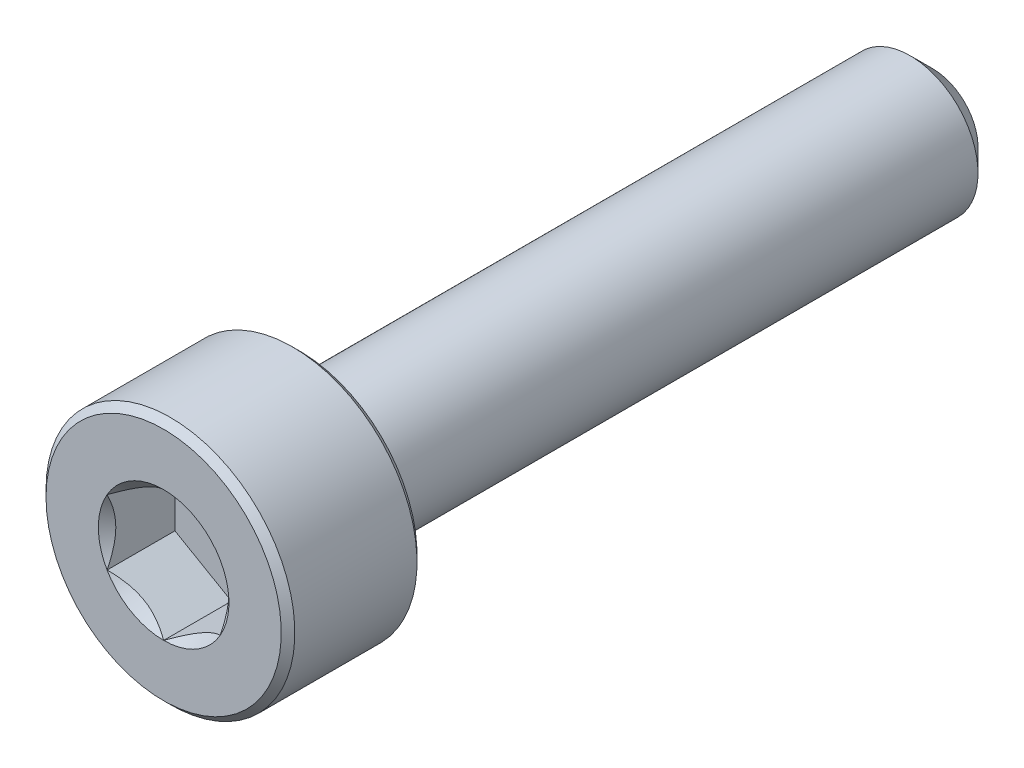
ISO-10303-21;
HEADER;
FILE_DESCRIPTION(('STEP AP214'),'2;1');
FILE_NAME('part.step','',(''),(''),'','','');
FILE_SCHEMA(('AUTOMOTIVE_DESIGN { 1 0 10303 214 1 1 1 1 }'));
ENDSEC;
DATA;
#1=APPLICATION_CONTEXT('core data for automotive mechanical design processes');
#2=APPLICATION_PROTOCOL_DEFINITION('international standard','automotive_design',2000,#1);
#3=PRODUCT_CONTEXT('',#1,'mechanical');
#4=PRODUCT('Part','Part','',(#3));
#5=PRODUCT_RELATED_PRODUCT_CATEGORY('part','',(#4));
#6=PRODUCT_DEFINITION_FORMATION('','',#4);
#7=PRODUCT_DEFINITION_CONTEXT('part definition',#1,'design');
#8=PRODUCT_DEFINITION('design','',#6,#7);
#9=PRODUCT_DEFINITION_SHAPE('','',#8);
#10=(LENGTH_UNIT() NAMED_UNIT(*) SI_UNIT(.MILLI.,.METRE.));
#11=(NAMED_UNIT(*) PLANE_ANGLE_UNIT() SI_UNIT($,.RADIAN.));
#12=(NAMED_UNIT(*) SI_UNIT($,.STERADIAN.) SOLID_ANGLE_UNIT());
#13=UNCERTAINTY_MEASURE_WITH_UNIT(LENGTH_MEASURE(1.E-05),#10,'distance_accuracy_value','');
#14=(GEOMETRIC_REPRESENTATION_CONTEXT(3) GLOBAL_UNCERTAINTY_ASSIGNED_CONTEXT((#13)) GLOBAL_UNIT_ASSIGNED_CONTEXT((#10,
#11,#12)) REPRESENTATION_CONTEXT('',''));
#15=CARTESIAN_POINT('',(0.,0.,0.));
#16=DIRECTION('',(0.,0.,1.));
#17=DIRECTION('',(1.,0.,0.));
#18=AXIS2_PLACEMENT_3D('',#15,#16,#17);
#19=CARTESIAN_POINT('',(0.,2.6,8.5));
#20=DIRECTION('',(0.,0.,1.));
#21=DIRECTION('',(1.,0.,0.));
#22=AXIS2_PLACEMENT_3D('',#19,#20,#21);
#23=PLANE('',#22);
#24=CARTESIAN_POINT('',(0.,0.,8.5));
#25=DIRECTION('',(0.,0.,1.));
#26=DIRECTION('',(1.,0.,0.));
#27=AXIS2_PLACEMENT_3D('',#24,#25,#26);
#28=CIRCLE('',#27,1.44337567297406);
#29=CARTESIAN_POINT('',(1.25,0.721687836487032,8.5));
#30=VERTEX_POINT('',#29);
#31=CARTESIAN_POINT('',(0.,1.44337567297406,8.5));
#32=VERTEX_POINT('',#31);
#33=EDGE_CURVE('E92',#30,#32,#28,.T.);
#34=ORIENTED_EDGE('',*,*,#33,.F.);
#35=CARTESIAN_POINT('',(1.25,-0.721687836487033,8.5));
#36=VERTEX_POINT('',#35);
#37=EDGE_CURVE('E52',#36,#30,#28,.T.);
#38=ORIENTED_EDGE('',*,*,#37,.F.);
#39=CARTESIAN_POINT('',(0.,-1.44337567297406,8.5));
#40=VERTEX_POINT('',#39);
#41=EDGE_CURVE('E278',#40,#36,#28,.T.);
#42=ORIENTED_EDGE('',*,*,#41,.F.);
#43=CARTESIAN_POINT('',(-1.25,-0.72168783648703,8.5));
#44=VERTEX_POINT('',#43);
#45=EDGE_CURVE('E59',#44,#40,#28,.T.);
#46=ORIENTED_EDGE('',*,*,#45,.F.);
#47=CARTESIAN_POINT('',(-1.25,0.721687836487034,8.5));
#48=VERTEX_POINT('',#47);
#49=EDGE_CURVE('E128',#48,#44,#28,.T.);
#50=ORIENTED_EDGE('',*,*,#49,.F.);
#51=EDGE_CURVE('E101',#32,#48,#28,.T.);
#52=ORIENTED_EDGE('',*,*,#51,.F.);
#53=EDGE_LOOP('',(#34,#38,#42,#46,#50,#52));
#54=FACE_BOUND('',#53,.T.);
#55=CARTESIAN_POINT('',(0.,0.,8.5));
#56=DIRECTION('',(0.,0.,-1.));
#57=DIRECTION('',(-1.,0.,0.));
#58=AXIS2_PLACEMENT_3D('',#55,#56,#57);
#59=CIRCLE('',#58,2.6);
#60=CARTESIAN_POINT('',(-2.6,0.,8.5));
#61=VERTEX_POINT('',#60);
#62=EDGE_CURVE('E46',#61,#61,#59,.T.);
#63=ORIENTED_EDGE('',*,*,#62,.F.);
#64=EDGE_LOOP('',(#63));
#65=FACE_BOUND('',#64,.T.);
#66=ADVANCED_FACE('F33',(#54,#65),#23,.T.);
#67=CARTESIAN_POINT('',(0.,0.,8.35));
#68=DIRECTION('',(0.,0.,-1.));
#69=DIRECTION('',(-1.,0.,0.));
#70=AXIS2_PLACEMENT_3D('',#67,#68,#69);
#71=CONICAL_SURFACE('',#70,2.75,0.785398163397443);
#72=ORIENTED_EDGE('',*,*,#62,.T.);
#73=EDGE_LOOP('',(#72));
#74=FACE_BOUND('',#73,.T.);
#75=CARTESIAN_POINT('',(0.,0.,8.35));
#76=DIRECTION('',(0.,0.,-1.));
#77=DIRECTION('',(-1.,0.,0.));
#78=AXIS2_PLACEMENT_3D('',#75,#76,#77);
#79=CIRCLE('',#78,2.75);
#80=CARTESIAN_POINT('',(-2.75,0.,8.35));
#81=VERTEX_POINT('',#80);
#82=EDGE_CURVE('E212',#81,#81,#79,.T.);
#83=ORIENTED_EDGE('',*,*,#82,.F.);
#84=EDGE_LOOP('',(#83));
#85=FACE_BOUND('',#84,.T.);
#86=ADVANCED_FACE('F217',(#74,#85),#71,.T.);
#87=CARTESIAN_POINT('',(0.,0.,-8.5));
#88=DIRECTION('',(0.,0.,-1.));
#89=DIRECTION('',(-1.,0.,0.));
#90=AXIS2_PLACEMENT_3D('',#87,#88,#89);
#91=CYLINDRICAL_SURFACE('',#90,2.75);
#92=ORIENTED_EDGE('',*,*,#82,.T.);
#93=EDGE_LOOP('',(#92));
#94=FACE_BOUND('',#93,.T.);
#95=CARTESIAN_POINT('',(0.,0.,5.65));
#96=DIRECTION('',(0.,0.,-1.));
#97=DIRECTION('',(-1.,0.,0.));
#98=AXIS2_PLACEMENT_3D('',#95,#96,#97);
#99=CIRCLE('',#98,2.75);
#100=CARTESIAN_POINT('',(-2.75,0.,5.65));
#101=VERTEX_POINT('',#100);
#102=EDGE_CURVE('E209',#101,#101,#99,.T.);
#103=ORIENTED_EDGE('',*,*,#102,.F.);
#104=EDGE_LOOP('',(#103));
#105=FACE_BOUND('',#104,.T.);
#106=ADVANCED_FACE('F223',(#94,#105),#91,.T.);
#107=CARTESIAN_POINT('',(0.,0.,5.5));
#108=DIRECTION('',(0.,0.,1.));
#109=DIRECTION('',(1.,0.,0.));
#110=AXIS2_PLACEMENT_3D('',#107,#108,#109);
#111=CONICAL_SURFACE('',#110,2.6,0.785398163397448);
#112=ORIENTED_EDGE('',*,*,#102,.T.);
#113=EDGE_LOOP('',(#112));
#114=FACE_BOUND('',#113,.T.);
#115=CARTESIAN_POINT('',(0.,0.,5.5));
#116=DIRECTION('',(0.,0.,-1.));
#117=DIRECTION('',(-1.,0.,0.));
#118=AXIS2_PLACEMENT_3D('',#115,#116,#117);
#119=CIRCLE('',#118,2.6);
#120=CARTESIAN_POINT('',(-2.6,0.,5.5));
#121=VERTEX_POINT('',#120);
#122=EDGE_CURVE('E206',#121,#121,#119,.T.);
#123=ORIENTED_EDGE('',*,*,#122,.F.);
#124=EDGE_LOOP('',(#123));
#125=FACE_BOUND('',#124,.T.);
#126=ADVANCED_FACE('F227',(#114,#125),#111,.T.);
#127=CARTESIAN_POINT('',(0.,2.6,5.5));
#128=DIRECTION('',(0.,0.,-1.));
#129=DIRECTION('',(-1.,0.,0.));
#130=AXIS2_PLACEMENT_3D('',#127,#128,#129);
#131=PLANE('',#130);
#132=ORIENTED_EDGE('',*,*,#122,.T.);
#133=EDGE_LOOP('',(#132));
#134=FACE_BOUND('',#133,.T.);
#135=CARTESIAN_POINT('',(0.,0.,5.5));
#136=DIRECTION('',(0.,0.,-1.));
#137=DIRECTION('',(-1.,0.,0.));
#138=AXIS2_PLACEMENT_3D('',#135,#136,#137);
#139=CIRCLE('',#138,1.5);
#140=CARTESIAN_POINT('',(-1.5,0.,5.5));
#141=VERTEX_POINT('',#140);
#142=EDGE_CURVE('E203',#141,#141,#139,.T.);
#143=ORIENTED_EDGE('',*,*,#142,.F.);
#144=EDGE_LOOP('',(#143));
#145=FACE_BOUND('',#144,.T.);
#146=ADVANCED_FACE('F233',(#134,#145),#131,.T.);
#147=CARTESIAN_POINT('',(0.,0.,-8.5));
#148=DIRECTION('',(0.,0.,-1.));
#149=DIRECTION('',(-1.,0.,0.));
#150=AXIS2_PLACEMENT_3D('',#147,#148,#149);
#151=CYLINDRICAL_SURFACE('',#150,1.5);
#152=ORIENTED_EDGE('',*,*,#142,.T.);
#153=EDGE_LOOP('',(#152));
#154=FACE_BOUND('',#153,.T.);
#155=CARTESIAN_POINT('',(0.,0.,-7.99999999999999));
#156=DIRECTION('',(0.,0.,-1.));
#157=DIRECTION('',(-1.,0.,0.));
#158=AXIS2_PLACEMENT_3D('',#155,#156,#157);
#159=CIRCLE('',#158,1.5);
#160=CARTESIAN_POINT('',(-1.5,0.,-7.99999999999999));
#161=VERTEX_POINT('',#160);
#162=EDGE_CURVE('E200',#161,#161,#159,.T.);
#163=ORIENTED_EDGE('',*,*,#162,.F.);
#164=EDGE_LOOP('',(#163));
#165=FACE_BOUND('',#164,.T.);
#166=ADVANCED_FACE('F237',(#154,#165),#151,.T.);
#167=CARTESIAN_POINT('',(0.,0.,-8.5));
#168=DIRECTION('',(0.,0.,1.));
#169=DIRECTION('',(1.,0.,0.));
#170=AXIS2_PLACEMENT_3D('',#167,#168,#169);
#171=CONICAL_SURFACE('',#170,1.,0.785398163397443);
#172=ORIENTED_EDGE('',*,*,#162,.T.);
#173=EDGE_LOOP('',(#172));
#174=FACE_BOUND('',#173,.T.);
#175=CARTESIAN_POINT('',(0.,0.,-8.5));
#176=DIRECTION('',(0.,0.,-1.));
#177=DIRECTION('',(-1.,0.,0.));
#178=AXIS2_PLACEMENT_3D('',#175,#176,#177);
#179=CIRCLE('',#178,1.);
#180=CARTESIAN_POINT('',(-1.,0.,-8.5));
#181=VERTEX_POINT('',#180);
#182=EDGE_CURVE('E188',#181,#181,#179,.T.);
#183=ORIENTED_EDGE('',*,*,#182,.F.);
#184=EDGE_LOOP('',(#183));
#185=FACE_BOUND('',#184,.T.);
#186=ADVANCED_FACE('F240',(#174,#185),#171,.T.);
#187=CARTESIAN_POINT('',(0.,1.,-8.5));
#188=DIRECTION('',(0.,0.,-1.));
#189=DIRECTION('',(-1.,0.,0.));
#190=AXIS2_PLACEMENT_3D('',#187,#188,#189);
#191=PLANE('',#190);
#192=ORIENTED_EDGE('',*,*,#182,.T.);
#193=EDGE_LOOP('',(#192));
#194=FACE_BOUND('',#193,.T.);
#195=ADVANCED_FACE('F161',(#194),#191,.T.);
#196=CARTESIAN_POINT('',(0.,0.,8.5));
#197=DIRECTION('',(0.,0.,1.));
#198=DIRECTION('',(1.,0.,0.));
#199=AXIS2_PLACEMENT_3D('',#196,#197,#198);
#200=CONICAL_SURFACE('',#199,1.44337567297406,0.78539816339745);
#201=ORIENTED_EDGE('',*,*,#51,.T.);
#202=CARTESIAN_POINT('',(0.000199999999999744,1.4434911430279,8.50011548390914));
#203=CARTESIAN_POINT('',(-0.0427751670715867,1.41867941875065,8.47532166805511));
#204=CARTESIAN_POINT('',(-0.086469004745948,1.39345276980743,8.45198373441869));
#205=CARTESIAN_POINT('',(-0.175565930841942,1.34201263554194,8.40925200408454));
#206=CARTESIAN_POINT('',(-0.220977498357064,1.31579425481276,8.38988199236042));
#207=CARTESIAN_POINT('',(-0.312547820935259,1.26292610442246,8.35670048341348));
#208=CARTESIAN_POINT('',(-0.358683240175885,1.23628980770471,8.34280555905266));
#209=CARTESIAN_POINT('',(-0.451970080407592,1.18243062538508,8.32139728216064));
#210=CARTESIAN_POINT('',(-0.499118649136379,1.15520938653761,8.31386794156679));
#211=CARTESIAN_POINT('',(-0.580373556887251,1.10829684367467,8.3070744980507));
#212=CARTESIAN_POINT('',(-0.61437487662794,1.08866617256958,8.30606855910435));
#213=CARTESIAN_POINT('',(-0.682317764432477,1.04943932800611,8.30776141491132));
#214=CARTESIAN_POINT('',(-0.716259317655657,1.02984316311599,8.31046102721554));
#215=CARTESIAN_POINT('',(-0.783814856457499,0.9908399546035,8.31940893031638));
#216=CARTESIAN_POINT('',(-0.817428507286774,0.971433104248772,8.32566052589971));
#217=CARTESIAN_POINT('',(-0.884094638217812,0.932943395609906,8.34137568141391));
#218=CARTESIAN_POINT('',(-0.917146871030295,0.913860680098301,8.35084062008746));
#219=CARTESIAN_POINT('',(-1.00179969160026,0.864986351354569,8.37893139068759));
#220=CARTESIAN_POINT('',(-1.05286649242964,0.835502920149077,8.3996701574522));
#221=CARTESIAN_POINT('',(-1.15300085411325,0.777690319475909,8.44638713467148));
#222=CARTESIAN_POINT('',(-1.20207431157827,0.749357745598417,8.47234829594677));
#223=CARTESIAN_POINT('',(-1.2502,0.721572366433195,8.50011548390914));
#224=B_SPLINE_CURVE_WITH_KNOTS('',3,(#202,#203,#204,#205,#206,#207,#208,#209,#210,#211,#212,
#213,#214,#215,#216,#217,#218,#219,#220,#221,#222,#223),.UNSPECIFIED.,.F.,.F.,(4,2,2,2,2,2,2,2,
2,2,4),(0.,0.166533409618303,0.334037607289761,0.498880396489698,0.663307919240273,
0.780963963458825,0.898645970148452,1.01643764860773,1.13427993171549,1.32148652032141,
1.50809158792573),.UNSPECIFIED.);
#225=EDGE_CURVE('E11',#32,#48,#224,.T.);
#226=ORIENTED_EDGE('',*,*,#225,.F.);
#227=EDGE_LOOP('',(#201,#226));
#228=FACE_BOUND('',#227,.T.);
#229=ADVANCED_FACE('F105',(#228),#200,.F.);
#230=ORIENTED_EDGE('',*,*,#49,.T.);
#231=CARTESIAN_POINT('',(-1.25,-1.38510182026143,8.92237003651893));
#232=CARTESIAN_POINT('',(-1.25,-1.35111986791654,8.89714624624165));
#233=CARTESIAN_POINT('',(-1.25,-1.31694282798165,8.87218595709871));
#234=CARTESIAN_POINT('',(-1.25,-1.24812142703778,8.82289946459782));
#235=CARTESIAN_POINT('',(-1.25,-1.21347694519278,8.79857343015524));
#236=CARTESIAN_POINT('',(-1.25,-1.10822083307585,8.72636172374247));
#237=CARTESIAN_POINT('',(-1.25,-1.03680313809814,8.67963105654717));
#238=CARTESIAN_POINT('',(-1.25,-0.887382774503049,8.58837288422405));
#239=CARTESIAN_POINT('',(-1.25,-0.809230860354648,8.54408680062095));
#240=CARTESIAN_POINT('',(-1.25,-0.64909596962788,8.46341771993846));
#241=CARTESIAN_POINT('',(-1.25,-0.567127025778807,8.42700818374294));
#242=CARTESIAN_POINT('',(-1.25,-0.443557329507032,8.38248253765294));
#243=CARTESIAN_POINT('',(-1.25,-0.403672751512106,8.36961750891589));
#244=CARTESIAN_POINT('',(-1.25,-0.322988211982144,8.34709732599784));
#245=CARTESIAN_POINT('',(-1.25,-0.282188183066514,8.33744240892579));
#246=CARTESIAN_POINT('',(-1.25,-0.200572985420666,8.32199119638416));
#247=CARTESIAN_POINT('',(-1.25,-0.159769911896365,8.31613197737595));
#248=CARTESIAN_POINT('',(-1.25,-0.0777868304089238,8.30837795446847));
#249=CARTESIAN_POINT('',(-1.25,-0.0366068784025135,8.30648257133364));
#250=CARTESIAN_POINT('',(-1.25,0.0444682995491154,8.30677812945619));
#251=CARTESIAN_POINT('',(-1.25,0.0843640378229438,8.30884503442731));
#252=CARTESIAN_POINT('',(-1.25,0.163790547253528,8.31668957022574));
#253=CARTESIAN_POINT('',(-1.25,0.203321243504861,8.3224679461945));
#254=CARTESIAN_POINT('',(-1.25,0.282393986569086,8.33752741684666));
#255=CARTESIAN_POINT('',(-1.25,0.321924894821446,8.34686615693867));
#256=CARTESIAN_POINT('',(-1.25,0.400129025325507,8.36856655334425));
#257=CARTESIAN_POINT('',(-1.25,0.438802336675167,8.380927894012));
#258=CARTESIAN_POINT('',(-1.25,0.563172796674043,8.42526147457396));
#259=CARTESIAN_POINT('',(-1.25,0.647028633361639,8.46238856081833));
#260=CARTESIAN_POINT('',(-1.25,0.810774511829943,8.54485212067594));
#261=CARTESIAN_POINT('',(-1.25,0.890648632035887,8.59021863392704));
#262=CARTESIAN_POINT('',(-1.25,1.04325497137231,8.68372167893417));
#263=CARTESIAN_POINT('',(-1.25,1.11614441495489,8.73160472191527));
#264=CARTESIAN_POINT('',(-1.25,1.22353402780521,8.80558839420389));
#265=CARTESIAN_POINT('',(-1.25,1.25886567990417,8.83050307314204));
#266=CARTESIAN_POINT('',(-1.25,1.32904842299966,8.88098117650382));
#267=CARTESIAN_POINT('',(-1.25,1.36389964210964,8.90654442260415));
#268=CARTESIAN_POINT('',(-1.25,1.39855118205095,8.93237628525925));
#269=B_SPLINE_CURVE_WITH_KNOTS('',3,(#231,#232,#233,#234,#235,#236,#237,#238,#239,#240,#241,
#242,#243,#244,#245,#246,#247,#248,#249,#250,#251,#252,#253,#254,#255,#256,#257,#258,#259,#260,
#261,#262,#263,#264,#265,#266,#267,#268),.UNSPECIFIED.,.F.,.F.,(4,2,2,2,2,2,2,2,2,2,2,2,2,2,2,2,
2,2,4),(0.,0.126957685892467,0.253948844888987,0.509869208273041,0.77911544356967,
1.04743984536898,1.17305649245659,1.29868241592515,1.42216852630225,1.5456365903859,
1.6653025991614,1.78499264045314,1.90670905612004,2.02841276654157,2.30272027119573,
2.57804870101489,2.83955156876987,2.96924486861395,3.09890288771825),.UNSPECIFIED.);
#270=EDGE_CURVE('E100',#48,#44,#269,.F.);
#271=ORIENTED_EDGE('',*,*,#270,.F.);
#272=EDGE_LOOP('',(#230,#271));
#273=FACE_BOUND('',#272,.T.);
#274=ADVANCED_FACE('F255',(#273),#200,.F.);
#275=ORIENTED_EDGE('',*,*,#45,.T.);
#276=CARTESIAN_POINT('',(-1.2502,-0.721572366433195,8.50011548390914));
#277=CARTESIAN_POINT('',(-1.20722483292841,-0.746384090710444,8.47532166805511));
#278=CARTESIAN_POINT('',(-1.16353099525405,-0.771610739653664,8.45198373441869));
#279=CARTESIAN_POINT('',(-1.07443406915806,-0.823050873919154,8.40925200408454));
#280=CARTESIAN_POINT('',(-1.02902250164294,-0.849269254648333,8.38988199236042));
#281=CARTESIAN_POINT('',(-0.937452179064742,-0.902137405038635,8.35670048341348));
#282=CARTESIAN_POINT('',(-0.891316759824117,-0.928773701756386,8.34280555905266));
#283=CARTESIAN_POINT('',(-0.79802991959241,-0.982632884076012,8.32139728216064));
#284=CARTESIAN_POINT('',(-0.750881350863622,-1.00985412292348,8.31386794156679));
#285=CARTESIAN_POINT('',(-0.66962644311275,-1.05676666578643,8.3070744980507));
#286=CARTESIAN_POINT('',(-0.635625123372061,-1.07639733689152,8.30606855910435));
#287=CARTESIAN_POINT('',(-0.567682235567525,-1.11562418145499,8.30776141491132));
#288=CARTESIAN_POINT('',(-0.533740682344345,-1.1352203463451,8.31046102721554));
#289=CARTESIAN_POINT('',(-0.466185143542503,-1.1742235548576,8.31940893031638));
#290=CARTESIAN_POINT('',(-0.432571492713227,-1.19363040521232,8.32566052589971));
#291=CARTESIAN_POINT('',(-0.365905361782189,-1.23212011385119,8.3413756814139));
#292=CARTESIAN_POINT('',(-0.332853128969707,-1.2512028293628,8.35084062008746));
#293=CARTESIAN_POINT('',(-0.248200308399738,-1.30007715810653,8.37893139068759));
#294=CARTESIAN_POINT('',(-0.197133507570363,-1.32956058931202,8.3996701574522));
#295=CARTESIAN_POINT('',(-0.0969991458867461,-1.38737318998519,8.44638713467148));
#296=CARTESIAN_POINT('',(-0.0479256884217311,-1.41570576386268,8.47234829594677));
#297=CARTESIAN_POINT('',(0.000199999999999774,-1.4434911430279,8.50011548390914));
#298=B_SPLINE_CURVE_WITH_KNOTS('',3,(#276,#277,#278,#279,#280,#281,#282,#283,#284,#285,#286,
#287,#288,#289,#290,#291,#292,#293,#294,#295,#296,#297),.UNSPECIFIED.,.F.,.F.,(4,2,2,2,2,2,2,2,
2,2,4),(0.,0.166533409618303,0.33403760728976,0.498880396489696,0.663307919240272,
0.780963963458825,0.898645970148451,1.01643764860773,1.13427993171549,1.32148652032141,
1.50809158792574),.UNSPECIFIED.);
#299=EDGE_CURVE('E137',#44,#40,#298,.T.);
#300=ORIENTED_EDGE('',*,*,#299,.F.);
#301=EDGE_LOOP('',(#275,#300));
#302=FACE_BOUND('',#301,.T.);
#303=ADVANCED_FACE('F259',(#302),#200,.F.);
#304=ORIENTED_EDGE('',*,*,#41,.T.);
#305=CARTESIAN_POINT('',(-0.000200000000000316,-1.4434911430279,8.50011548390914));
#306=CARTESIAN_POINT('',(0.0427751670715862,-1.41867941875065,8.47532166805511));
#307=CARTESIAN_POINT('',(0.0864690047459475,-1.39345276980743,8.45198373441869));
#308=CARTESIAN_POINT('',(0.175565930841941,-1.34201263554194,8.40925200408454));
#309=CARTESIAN_POINT('',(0.220977498357063,-1.31579425481276,8.38988199236042));
#310=CARTESIAN_POINT('',(0.312547820935258,-1.26292610442246,8.35670048341348));
#311=CARTESIAN_POINT('',(0.358683240175884,-1.23628980770471,8.34280555905266));
#312=CARTESIAN_POINT('',(0.45197008040759,-1.18243062538509,8.32139728216064));
#313=CARTESIAN_POINT('',(0.499118649136378,-1.15520938653761,8.31386794156679));
#314=CARTESIAN_POINT('',(0.58037355688725,-1.10829684367467,8.3070744980507));
#315=CARTESIAN_POINT('',(0.614374876627939,-1.08866617256958,8.30606855910435));
#316=CARTESIAN_POINT('',(0.682317764432475,-1.04943932800611,8.30776141491132));
#317=CARTESIAN_POINT('',(0.716259317655655,-1.02984316311599,8.31046102721554));
#318=CARTESIAN_POINT('',(0.783814856457497,-0.990839954603501,8.31940893031638));
#319=CARTESIAN_POINT('',(0.817428507286773,-0.971433104248773,8.32566052589971));
#320=CARTESIAN_POINT('',(0.884094638217811,-0.932943395609907,8.3413756814139));
#321=CARTESIAN_POINT('',(0.917146871030293,-0.913860680098302,8.35084062008746));
#322=CARTESIAN_POINT('',(1.00179969160026,-0.864986351354569,8.37893139068759));
#323=CARTESIAN_POINT('',(1.05286649242964,-0.835502920149077,8.3996701574522));
#324=CARTESIAN_POINT('',(1.15300085411325,-0.77769031947591,8.44638713467148));
#325=CARTESIAN_POINT('',(1.20207431157827,-0.749357745598418,8.47234829594677));
#326=CARTESIAN_POINT('',(1.2502,-0.721572366433196,8.50011548390914));
#327=B_SPLINE_CURVE_WITH_KNOTS('',3,(#305,#306,#307,#308,#309,#310,#311,#312,#313,#314,#315,
#316,#317,#318,#319,#320,#321,#322,#323,#324,#325,#326),.UNSPECIFIED.,.F.,.F.,(4,2,2,2,2,2,2,2,
2,2,4),(0.,0.166533409618303,0.33403760728976,0.498880396489696,0.663307919240272,
0.780963963458824,0.89864597014845,1.01643764860773,1.13427993171549,1.32148652032141,
1.50809158792573),.UNSPECIFIED.);
#328=EDGE_CURVE('E280',#40,#36,#327,.T.);
#329=ORIENTED_EDGE('',*,*,#328,.F.);
#330=EDGE_LOOP('',(#304,#329));
#331=FACE_BOUND('',#330,.T.);
#332=ADVANCED_FACE('F268',(#331),#200,.F.);
#333=ORIENTED_EDGE('',*,*,#37,.T.);
#334=CARTESIAN_POINT('',(1.25,-1.38510181874983,8.92237003539674));
#335=CARTESIAN_POINT('',(1.25,-1.3511198664462,8.89714624516244));
#336=CARTESIAN_POINT('',(1.25,-1.31694282655271,8.87218595606241));
#337=CARTESIAN_POINT('',(1.25,-1.24812142569208,8.82289946364711));
#338=CARTESIAN_POINT('',(1.25,-1.21347694388892,8.7985734292472));
#339=CARTESIAN_POINT('',(1.25,-1.10822083190006,8.72636172296323));
#340=CARTESIAN_POINT('',(1.25,-1.0368031370095,8.67963105585342));
#341=CARTESIAN_POINT('',(1.25,-0.887382773604423,8.58837288370571));
#342=CARTESIAN_POINT('',(1.25,-0.809230859559388,8.54408680019188));
#343=CARTESIAN_POINT('',(1.25,-0.649095969048193,8.46341771967474));
#344=CARTESIAN_POINT('',(1.25,-0.567127025311258,8.42700818355541));
#345=CARTESIAN_POINT('',(1.25,-0.443557329124526,8.38248253752399));
#346=CARTESIAN_POINT('',(1.25,-0.403672751095207,8.36961750878661));
#347=CARTESIAN_POINT('',(1.25,-0.322988211495525,8.34709732587494));
#348=CARTESIAN_POINT('',(1.25,-0.28218818254457,8.3374424088096));
#349=CARTESIAN_POINT('',(1.25,-0.200572984829335,8.32199119628927));
#350=CARTESIAN_POINT('',(1.25,-0.159769911270982,8.31613197729548));
#351=CARTESIAN_POINT('',(1.25,-0.0777868297167931,8.30837795442431));
#352=CARTESIAN_POINT('',(1.25,-0.0366068776776872,8.30648257131138));
#353=CARTESIAN_POINT('',(1.25,0.0444683003388063,8.30677812948321));
#354=CARTESIAN_POINT('',(1.25,0.0843640386448798,8.3088450344818));
#355=CARTESIAN_POINT('',(1.25,0.16379054813703,8.3166895703397));
#356=CARTESIAN_POINT('',(1.25,0.203321244417683,8.32246794634046));
#357=CARTESIAN_POINT('',(1.25,0.282393987539771,8.33752741705993));
#358=CARTESIAN_POINT('',(1.25,0.321924895820597,8.34686615718743));
#359=CARTESIAN_POINT('',(1.25,0.400129026379048,8.36856655366507));
#360=CARTESIAN_POINT('',(1.25,0.438802337754634,8.38092789436938));
#361=CARTESIAN_POINT('',(1.25,0.563172797994067,8.42526147510656));
#362=CARTESIAN_POINT('',(1.25,0.647028634884196,8.46238856151275));
#363=CARTESIAN_POINT('',(1.25,0.810774513742063,8.54485212171168));
#364=CARTESIAN_POINT('',(1.25,0.89064863413494,8.59021863514241));
#365=CARTESIAN_POINT('',(1.25,1.04325497380785,8.68372168049333));
#366=CARTESIAN_POINT('',(1.25,1.11614441754118,8.73160472363706));
#367=CARTESIAN_POINT('',(1.25,1.22353403061444,8.8055883961688));
#368=CARTESIAN_POINT('',(1.25,1.25886568278664,8.83050307518733));
#369=CARTESIAN_POINT('',(1.25,1.32904842602817,8.8809811787098));
#370=CARTESIAN_POINT('',(1.25,1.36389964521094,8.90654442489043));
#371=CARTESIAN_POINT('',(1.25,1.39855118522491,8.93237628762573));
#372=B_SPLINE_CURVE_WITH_KNOTS('',3,(#334,#335,#336,#337,#338,#339,#340,#341,#342,#343,#344,
#345,#346,#347,#348,#349,#350,#351,#352,#353,#354,#355,#356,#357,#358,#359,#360,#361,#362,#363,
#364,#365,#366,#367,#368,#369,#370,#371),.UNSPECIFIED.,.F.,.F.,(4,2,2,2,2,2,2,2,2,2,2,2,2,2,2,2,
2,2,4),(0.,0.126957685716233,0.253948844536466,0.509869207561398,0.779115442456377,
1.04743984385779,1.17305649104353,1.29868241461005,1.42216852508156,1.54563658925964,
1.66530259813563,1.78499263952808,1.90670905530249,2.02841276583151,2.30272027123448,
2.57804870180744,2.83955157020837,2.96924487037104,3.0989028897939),.UNSPECIFIED.);
#373=EDGE_CURVE('E117',#36,#30,#372,.T.);
#374=ORIENTED_EDGE('',*,*,#373,.F.);
#375=EDGE_LOOP('',(#333,#374));
#376=FACE_BOUND('',#375,.T.);
#377=ADVANCED_FACE('F262',(#376),#200,.F.);
#378=ORIENTED_EDGE('',*,*,#33,.T.);
#379=CARTESIAN_POINT('',(1.2502,0.721572366433195,8.50011548390914));
#380=CARTESIAN_POINT('',(1.20722483292841,0.746384090710445,8.4753216680551));
#381=CARTESIAN_POINT('',(1.16353099525405,0.771610739653665,8.45198373441868));
#382=CARTESIAN_POINT('',(1.07443406915806,0.823050873919155,8.40925200408454));
#383=CARTESIAN_POINT('',(1.02902250164294,0.849269254648334,8.38988199236042));
#384=CARTESIAN_POINT('',(0.937452179064739,0.902137405038636,8.35670048341348));
#385=CARTESIAN_POINT('',(0.891316759824113,0.928773701756387,8.34280555905266));
#386=CARTESIAN_POINT('',(0.798029919592407,0.982632884076013,8.32139728216064));
#387=CARTESIAN_POINT('',(0.75088135086362,1.00985412292348,8.31386794156679));
#388=CARTESIAN_POINT('',(0.669626443112747,1.05676666578643,8.3070744980507));
#389=CARTESIAN_POINT('',(0.635625123372058,1.07639733689152,8.30606855910435));
#390=CARTESIAN_POINT('',(0.567682235567522,1.11562418145499,8.30776141491132));
#391=CARTESIAN_POINT('',(0.533740682344342,1.1352203463451,8.31046102721554));
#392=CARTESIAN_POINT('',(0.4661851435425,1.1742235548576,8.31940893031638));
#393=CARTESIAN_POINT('',(0.432571492713225,1.19363040521233,8.32566052589971));
#394=CARTESIAN_POINT('',(0.365905361782186,1.23212011385119,8.34137568141391));
#395=CARTESIAN_POINT('',(0.332853128969704,1.2512028293628,8.35084062008746));
#396=CARTESIAN_POINT('',(0.248200308399735,1.30007715810653,8.37893139068759));
#397=CARTESIAN_POINT('',(0.197133507570361,1.32956058931202,8.3996701574522));
#398=CARTESIAN_POINT('',(0.0969991458867446,1.38737318998519,8.44638713467148));
#399=CARTESIAN_POINT('',(0.04792568842173,1.41570576386268,8.47234829594677));
#400=CARTESIAN_POINT('',(-0.00020000000000024,1.4434911430279,8.50011548390914));
#401=B_SPLINE_CURVE_WITH_KNOTS('',3,(#379,#380,#381,#382,#383,#384,#385,#386,#387,#388,#389,
#390,#391,#392,#393,#394,#395,#396,#397,#398,#399,#400),.UNSPECIFIED.,.F.,.F.,(4,2,2,2,2,2,2,2,
2,2,4),(0.,0.166533409618304,0.334037607289761,0.498880396489698,0.663307919240274,
0.780963963458826,0.898645970148452,1.01643764860773,1.13427993171549,1.32148652032141,
1.50809158792573),.UNSPECIFIED.);
#402=EDGE_CURVE('E96',#30,#32,#401,.T.);
#403=ORIENTED_EDGE('',*,*,#402,.F.);
#404=EDGE_LOOP('',(#378,#403));
#405=FACE_BOUND('',#404,.T.);
#406=ADVANCED_FACE('F94',(#405),#200,.F.);
#407=CARTESIAN_POINT('',(0.,0.,7.));
#408=DIRECTION('',(0.,0.,1.));
#409=DIRECTION('',(1.,0.,0.));
#410=AXIS2_PLACEMENT_3D('',#407,#408,#409);
#411=PLANE('',#410);
#412=DIRECTION('',(-0.866025403784439,0.5,0.));
#413=VECTOR('',#412,1.);
#414=CARTESIAN_POINT('',(1.25,0.721687836487033,7.));
#415=LINE('',#414,#413);
#416=CARTESIAN_POINT('',(1.25,0.721687836487033,7.));
#417=VERTEX_POINT('',#416);
#418=CARTESIAN_POINT('',(0.,1.44337567297406,7.));
#419=VERTEX_POINT('',#418);
#420=EDGE_CURVE('E116',#417,#419,#415,.T.);
#421=ORIENTED_EDGE('',*,*,#420,.T.);
#422=DIRECTION('',(-0.866025403784439,-0.5,0.));
#423=VECTOR('',#422,1.);
#424=CARTESIAN_POINT('',(0.,1.44337567297406,7.));
#425=LINE('',#424,#423);
#426=CARTESIAN_POINT('',(-1.25,0.721687836487033,7.));
#427=VERTEX_POINT('',#426);
#428=EDGE_CURVE('E121',#419,#427,#425,.T.);
#429=ORIENTED_EDGE('',*,*,#428,.T.);
#430=DIRECTION('',(0.,-1.,0.));
#431=VECTOR('',#430,1.);
#432=CARTESIAN_POINT('',(-1.25,0.721687836487033,7.));
#433=LINE('',#432,#431);
#434=CARTESIAN_POINT('',(-1.25,-0.721687836487032,7.));
#435=VERTEX_POINT('',#434);
#436=EDGE_CURVE('E176',#427,#435,#433,.T.);
#437=ORIENTED_EDGE('',*,*,#436,.T.);
#438=DIRECTION('',(0.866025403784439,-0.5,0.));
#439=VECTOR('',#438,1.);
#440=CARTESIAN_POINT('',(-1.25,-0.721687836487032,7.));
#441=LINE('',#440,#439);
#442=CARTESIAN_POINT('',(0.,-1.44337567297406,7.));
#443=VERTEX_POINT('',#442);
#444=EDGE_CURVE('E179',#435,#443,#441,.T.);
#445=ORIENTED_EDGE('',*,*,#444,.T.);
#446=DIRECTION('',(0.866025403784439,0.5,0.));
#447=VECTOR('',#446,1.);
#448=CARTESIAN_POINT('',(0.,-1.44337567297406,7.));
#449=LINE('',#448,#447);
#450=CARTESIAN_POINT('',(1.25,-0.721687836487033,7.));
#451=VERTEX_POINT('',#450);
#452=EDGE_CURVE('E182',#443,#451,#449,.T.);
#453=ORIENTED_EDGE('',*,*,#452,.T.);
#454=DIRECTION('',(0.,1.,0.));
#455=VECTOR('',#454,1.);
#456=CARTESIAN_POINT('',(1.25,-0.721687836487033,7.));
#457=LINE('',#456,#455);
#458=EDGE_CURVE('E124',#451,#417,#457,.T.);
#459=ORIENTED_EDGE('',*,*,#458,.T.);
#460=EDGE_LOOP('',(#421,#429,#437,#445,#453,#459));
#461=FACE_BOUND('',#460,.T.);
#462=ADVANCED_FACE('F156',(#461),#411,.T.);
#463=CARTESIAN_POINT('',(0.,1.44337567297406,7.));
#464=DIRECTION('',(-0.5,0.866025403784439,0.));
#465=DIRECTION('',(-0.866025403784439,-0.5,0.));
#466=AXIS2_PLACEMENT_3D('',#463,#464,#465);
#467=PLANE('',#466);
#468=DIRECTION('',(0.,0.,1.));
#469=VECTOR('',#468,1.);
#470=CARTESIAN_POINT('',(0.,1.44337567297406,7.));
#471=LINE('',#470,#469);
#472=EDGE_CURVE('E113',#419,#32,#471,.T.);
#473=ORIENTED_EDGE('',*,*,#472,.T.);
#474=ORIENTED_EDGE('',*,*,#225,.T.);
#475=DIRECTION('',(0.,0.,1.));
#476=VECTOR('',#475,1.);
#477=CARTESIAN_POINT('',(-1.25,0.721687836487033,7.));
#478=LINE('',#477,#476);
#479=EDGE_CURVE('E123',#427,#48,#478,.T.);
#480=ORIENTED_EDGE('',*,*,#479,.F.);
#481=ORIENTED_EDGE('',*,*,#428,.F.);
#482=EDGE_LOOP('',(#473,#474,#480,#481));
#483=FACE_BOUND('',#482,.T.);
#484=ADVANCED_FACE('F119',(#483),#467,.F.);
#485=CARTESIAN_POINT('',(-1.25,0.721687836487033,7.));
#486=DIRECTION('',(-1.,0.,0.));
#487=DIRECTION('',(0.,-1.,0.));
#488=AXIS2_PLACEMENT_3D('',#485,#486,#487);
#489=PLANE('',#488);
#490=ORIENTED_EDGE('',*,*,#479,.T.);
#491=ORIENTED_EDGE('',*,*,#270,.T.);
#492=DIRECTION('',(0.,0.,1.));
#493=VECTOR('',#492,1.);
#494=CARTESIAN_POINT('',(-1.25,-0.721687836487032,7.));
#495=LINE('',#494,#493);
#496=EDGE_CURVE('E194',#435,#44,#495,.T.);
#497=ORIENTED_EDGE('',*,*,#496,.F.);
#498=ORIENTED_EDGE('',*,*,#436,.F.);
#499=EDGE_LOOP('',(#490,#491,#497,#498));
#500=FACE_BOUND('',#499,.T.);
#501=ADVANCED_FACE('F146',(#500),#489,.F.);
#502=CARTESIAN_POINT('',(-1.25,-0.721687836487032,7.));
#503=DIRECTION('',(-0.5,-0.866025403784439,0.));
#504=DIRECTION('',(0.866025403784439,-0.5,0.));
#505=AXIS2_PLACEMENT_3D('',#502,#503,#504);
#506=PLANE('',#505);
#507=ORIENTED_EDGE('',*,*,#496,.T.);
#508=ORIENTED_EDGE('',*,*,#299,.T.);
#509=DIRECTION('',(0.,0.,1.));
#510=VECTOR('',#509,1.);
#511=CARTESIAN_POINT('',(0.,-1.44337567297406,7.));
#512=LINE('',#511,#510);
#513=EDGE_CURVE('E191',#443,#40,#512,.T.);
#514=ORIENTED_EDGE('',*,*,#513,.F.);
#515=ORIENTED_EDGE('',*,*,#444,.F.);
#516=EDGE_LOOP('',(#507,#508,#514,#515));
#517=FACE_BOUND('',#516,.T.);
#518=ADVANCED_FACE('F149',(#517),#506,.F.);
#519=CARTESIAN_POINT('',(0.,-1.44337567297406,7.));
#520=DIRECTION('',(0.5,-0.866025403784439,0.));
#521=DIRECTION('',(0.866025403784439,0.5,0.));
#522=AXIS2_PLACEMENT_3D('',#519,#520,#521);
#523=PLANE('',#522);
#524=ORIENTED_EDGE('',*,*,#513,.T.);
#525=ORIENTED_EDGE('',*,*,#328,.T.);
#526=DIRECTION('',(0.,0.,1.));
#527=VECTOR('',#526,1.);
#528=CARTESIAN_POINT('',(1.25,-0.721687836487033,7.));
#529=LINE('',#528,#527);
#530=EDGE_CURVE('E189',#451,#36,#529,.T.);
#531=ORIENTED_EDGE('',*,*,#530,.F.);
#532=ORIENTED_EDGE('',*,*,#452,.F.);
#533=EDGE_LOOP('',(#524,#525,#531,#532));
#534=FACE_BOUND('',#533,.T.);
#535=ADVANCED_FACE('F286',(#534),#523,.F.);
#536=CARTESIAN_POINT('',(1.25,-0.721687836487033,7.));
#537=DIRECTION('',(1.,0.,0.));
#538=DIRECTION('',(0.,1.,0.));
#539=AXIS2_PLACEMENT_3D('',#536,#537,#538);
#540=PLANE('',#539);
#541=ORIENTED_EDGE('',*,*,#530,.T.);
#542=ORIENTED_EDGE('',*,*,#373,.T.);
#543=DIRECTION('',(0.,0.,1.));
#544=VECTOR('',#543,1.);
#545=CARTESIAN_POINT('',(1.25,0.721687836487033,7.));
#546=LINE('',#545,#544);
#547=EDGE_CURVE('E115',#417,#30,#546,.T.);
#548=ORIENTED_EDGE('',*,*,#547,.F.);
#549=ORIENTED_EDGE('',*,*,#458,.F.);
#550=EDGE_LOOP('',(#541,#542,#548,#549));
#551=FACE_BOUND('',#550,.T.);
#552=ADVANCED_FACE('F160',(#551),#540,.F.);
#553=CARTESIAN_POINT('',(1.25,0.721687836487033,7.));
#554=DIRECTION('',(0.5,0.866025403784439,0.));
#555=DIRECTION('',(-0.866025403784439,0.5,0.));
#556=AXIS2_PLACEMENT_3D('',#553,#554,#555);
#557=PLANE('',#556);
#558=ORIENTED_EDGE('',*,*,#547,.T.);
#559=ORIENTED_EDGE('',*,*,#402,.T.);
#560=ORIENTED_EDGE('',*,*,#472,.F.);
#561=ORIENTED_EDGE('',*,*,#420,.F.);
#562=EDGE_LOOP('',(#558,#559,#560,#561));
#563=FACE_BOUND('',#562,.T.);
#564=ADVANCED_FACE('F111',(#563),#557,.F.);
#565=CLOSED_SHELL('',(#66,#86,#106,#126,#146,#166,#186,#195,#229,#274,#303,#332,#377,#406,#462,
#484,#501,#518,#535,#552,#564));
#566=MANIFOLD_SOLID_BREP('B2',#565);
#567=ADVANCED_BREP_SHAPE_REPRESENTATION('',(#18,#566),#14);
#568=SHAPE_DEFINITION_REPRESENTATION(#9,#567);
ENDSEC;
END-ISO-10303-21;
